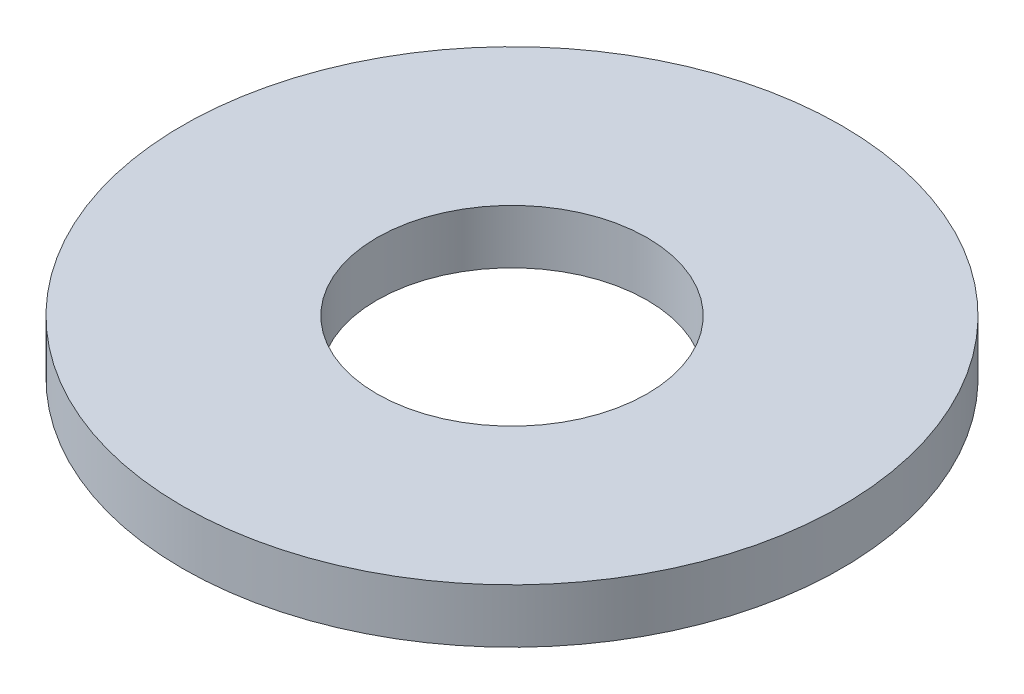
ISO-10303-21;
HEADER;
FILE_DESCRIPTION(('STEP AP214'),'2;1');
FILE_NAME('part.step','',(''),(''),'','','');
FILE_SCHEMA(('AUTOMOTIVE_DESIGN { 1 0 10303 214 1 1 1 1 }'));
ENDSEC;
DATA;
#1=APPLICATION_CONTEXT('core data for automotive mechanical design processes');
#2=APPLICATION_PROTOCOL_DEFINITION('international standard','automotive_design',2000,#1);
#3=PRODUCT_CONTEXT('',#1,'mechanical');
#4=PRODUCT('Part','Part','',(#3));
#5=PRODUCT_RELATED_PRODUCT_CATEGORY('part','',(#4));
#6=PRODUCT_DEFINITION_FORMATION('','',#4);
#7=PRODUCT_DEFINITION_CONTEXT('part definition',#1,'design');
#8=PRODUCT_DEFINITION('design','',#6,#7);
#9=PRODUCT_DEFINITION_SHAPE('','',#8);
#10=(LENGTH_UNIT() NAMED_UNIT(*) SI_UNIT(.MILLI.,.METRE.));
#11=(NAMED_UNIT(*) PLANE_ANGLE_UNIT() SI_UNIT($,.RADIAN.));
#12=(NAMED_UNIT(*) SI_UNIT($,.STERADIAN.) SOLID_ANGLE_UNIT());
#13=UNCERTAINTY_MEASURE_WITH_UNIT(LENGTH_MEASURE(1.E-05),#10,'distance_accuracy_value','');
#14=(GEOMETRIC_REPRESENTATION_CONTEXT(3) GLOBAL_UNCERTAINTY_ASSIGNED_CONTEXT((#13)) GLOBAL_UNIT_ASSIGNED_CONTEXT((#10,
#11,#12)) REPRESENTATION_CONTEXT('',''));
#15=CARTESIAN_POINT('',(0.,0.,0.));
#16=DIRECTION('',(0.,0.,1.));
#17=DIRECTION('',(1.,0.,0.));
#18=AXIS2_PLACEMENT_3D('',#15,#16,#17);
#19=CARTESIAN_POINT('',(0.,0.8,0.));
#20=DIRECTION('',(0.,1.,0.));
#21=DIRECTION('',(0.,0.,1.));
#22=AXIS2_PLACEMENT_3D('',#19,#20,#21);
#23=PLANE('',#22);
#24=CARTESIAN_POINT('',(0.,0.8,0.));
#25=DIRECTION('',(0.,1.,0.));
#26=DIRECTION('',(0.,0.,1.));
#27=AXIS2_PLACEMENT_3D('',#24,#25,#26);
#28=CIRCLE('',#27,4.875);
#29=CARTESIAN_POINT('',(0.,0.8,4.875));
#30=VERTEX_POINT('',#29);
#31=EDGE_CURVE('E10',#30,#30,#28,.T.);
#32=ORIENTED_EDGE('',*,*,#31,.T.);
#33=EDGE_LOOP('',(#32));
#34=FACE_BOUND('',#33,.T.);
#35=CARTESIAN_POINT('',(0.,0.8,0.));
#36=DIRECTION('',(0.,1.,0.));
#37=DIRECTION('',(0.,0.,1.));
#38=AXIS2_PLACEMENT_3D('',#35,#36,#37);
#39=CIRCLE('',#38,2.);
#40=CARTESIAN_POINT('',(0.,0.8,2.));
#41=VERTEX_POINT('',#40);
#42=EDGE_CURVE('E44',#41,#41,#39,.T.);
#43=ORIENTED_EDGE('',*,*,#42,.F.);
#44=EDGE_LOOP('',(#43));
#45=FACE_BOUND('',#44,.T.);
#46=ADVANCED_FACE('F33',(#34,#45),#23,.T.);
#47=CARTESIAN_POINT('',(0.,0.,0.));
#48=DIRECTION('',(0.,1.,0.));
#49=DIRECTION('',(0.,0.,1.));
#50=AXIS2_PLACEMENT_3D('',#47,#48,#49);
#51=PLANE('',#50);
#52=CARTESIAN_POINT('',(0.,0.,0.));
#53=DIRECTION('',(0.,1.,0.));
#54=DIRECTION('',(0.,0.,1.));
#55=AXIS2_PLACEMENT_3D('',#52,#53,#54);
#56=CIRCLE('',#55,4.875);
#57=CARTESIAN_POINT('',(0.,0.,4.875));
#58=VERTEX_POINT('',#57);
#59=EDGE_CURVE('E37',#58,#58,#56,.T.);
#60=ORIENTED_EDGE('',*,*,#59,.F.);
#61=EDGE_LOOP('',(#60));
#62=FACE_BOUND('',#61,.T.);
#63=CARTESIAN_POINT('',(0.,0.,0.));
#64=DIRECTION('',(0.,1.,0.));
#65=DIRECTION('',(0.,0.,1.));
#66=AXIS2_PLACEMENT_3D('',#63,#64,#65);
#67=CIRCLE('',#66,2.);
#68=CARTESIAN_POINT('',(0.,0.,2.));
#69=VERTEX_POINT('',#68);
#70=EDGE_CURVE('E46',#69,#69,#67,.T.);
#71=ORIENTED_EDGE('',*,*,#70,.T.);
#72=EDGE_LOOP('',(#71));
#73=FACE_BOUND('',#72,.T.);
#74=ADVANCED_FACE('F56',(#62,#73),#51,.F.);
#75=CARTESIAN_POINT('',(0.,0.8,0.));
#76=DIRECTION('',(0.,-1.,0.));
#77=DIRECTION('',(0.,0.,-1.));
#78=AXIS2_PLACEMENT_3D('',#75,#76,#77);
#79=CYLINDRICAL_SURFACE('',#78,4.875);
#80=ORIENTED_EDGE('',*,*,#31,.F.);
#81=EDGE_LOOP('',(#80));
#82=FACE_BOUND('',#81,.T.);
#83=ORIENTED_EDGE('',*,*,#59,.T.);
#84=EDGE_LOOP('',(#83));
#85=FACE_BOUND('',#84,.T.);
#86=ADVANCED_FACE('F35',(#82,#85),#79,.T.);
#87=CARTESIAN_POINT('',(0.,0.8,0.));
#88=DIRECTION('',(0.,-1.,0.));
#89=DIRECTION('',(0.,0.,-1.));
#90=AXIS2_PLACEMENT_3D('',#87,#88,#89);
#91=CYLINDRICAL_SURFACE('',#90,2.);
#92=ORIENTED_EDGE('',*,*,#42,.T.);
#93=EDGE_LOOP('',(#92));
#94=FACE_BOUND('',#93,.T.);
#95=ORIENTED_EDGE('',*,*,#70,.F.);
#96=EDGE_LOOP('',(#95));
#97=FACE_BOUND('',#96,.T.);
#98=ADVANCED_FACE('F52',(#94,#97),#91,.F.);
#99=CLOSED_SHELL('',(#46,#74,#86,#98));
#100=MANIFOLD_SOLID_BREP('B2',#99);
#101=ADVANCED_BREP_SHAPE_REPRESENTATION('',(#18,#100),#14);
#102=SHAPE_DEFINITION_REPRESENTATION(#9,#101);
ENDSEC;
END-ISO-10303-21;
